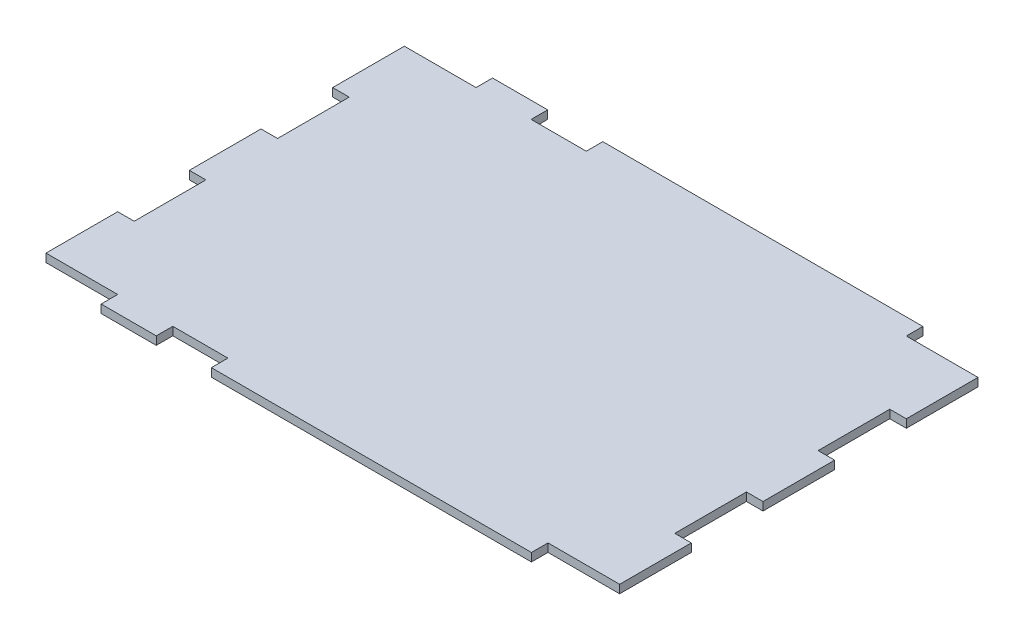
ISO-10303-21;
HEADER;
FILE_DESCRIPTION(('STEP AP214'),'2;1');
FILE_NAME('part.step','',(''),(''),'','','');
FILE_SCHEMA(('AUTOMOTIVE_DESIGN { 1 0 10303 214 1 1 1 1 }'));
ENDSEC;
DATA;
#1=APPLICATION_CONTEXT('core data for automotive mechanical design processes');
#2=APPLICATION_PROTOCOL_DEFINITION('international standard','automotive_design',2000,#1);
#3=PRODUCT_CONTEXT('',#1,'mechanical');
#4=PRODUCT('Part','Part','',(#3));
#5=PRODUCT_RELATED_PRODUCT_CATEGORY('part','',(#4));
#6=PRODUCT_DEFINITION_FORMATION('','',#4);
#7=PRODUCT_DEFINITION_CONTEXT('part definition',#1,'design');
#8=PRODUCT_DEFINITION('design','',#6,#7);
#9=PRODUCT_DEFINITION_SHAPE('','',#8);
#10=(LENGTH_UNIT() NAMED_UNIT(*) SI_UNIT(.MILLI.,.METRE.));
#11=(NAMED_UNIT(*) PLANE_ANGLE_UNIT() SI_UNIT($,.RADIAN.));
#12=(NAMED_UNIT(*) SI_UNIT($,.STERADIAN.) SOLID_ANGLE_UNIT());
#13=UNCERTAINTY_MEASURE_WITH_UNIT(LENGTH_MEASURE(1.E-05),#10,'distance_accuracy_value','');
#14=(GEOMETRIC_REPRESENTATION_CONTEXT(3) GLOBAL_UNCERTAINTY_ASSIGNED_CONTEXT((#13)) GLOBAL_UNIT_ASSIGNED_CONTEXT((#10,
#11,#12)) REPRESENTATION_CONTEXT('',''));
#15=CARTESIAN_POINT('',(0.,0.,0.));
#16=DIRECTION('',(0.,0.,1.));
#17=DIRECTION('',(1.,0.,0.));
#18=AXIS2_PLACEMENT_3D('',#15,#16,#17);
#19=CARTESIAN_POINT('',(-128.911356388129,3.,-52.));
#20=DIRECTION('',(1.,0.,0.));
#21=DIRECTION('',(0.,0.,-1.));
#22=AXIS2_PLACEMENT_3D('',#19,#20,#21);
#23=PLANE('',#22);
#24=DIRECTION('',(0.,0.,1.));
#25=VECTOR('',#24,1.);
#26=CARTESIAN_POINT('',(-128.911356388129,0.,-52.));
#27=LINE('',#26,#25);
#28=CARTESIAN_POINT('',(-128.911356388129,0.,-78.));
#29=VERTEX_POINT('',#28);
#30=CARTESIAN_POINT('',(-128.911356388129,0.,-52.));
#31=VERTEX_POINT('',#30);
#32=EDGE_CURVE('E312',#29,#31,#27,.T.);
#33=ORIENTED_EDGE('',*,*,#32,.T.);
#34=DIRECTION('',(0.,-1.,0.));
#35=VECTOR('',#34,1.);
#36=CARTESIAN_POINT('',(-128.911356388129,3.,-52.));
#37=LINE('',#36,#35);
#38=CARTESIAN_POINT('',(-128.911356388129,3.,-52.));
#39=VERTEX_POINT('',#38);
#40=EDGE_CURVE('E48',#39,#31,#37,.T.);
#41=ORIENTED_EDGE('',*,*,#40,.F.);
#42=DIRECTION('',(0.,0.,1.));
#43=VECTOR('',#42,1.);
#44=CARTESIAN_POINT('',(-128.911356388129,3.,-52.));
#45=LINE('',#44,#43);
#46=CARTESIAN_POINT('',(-128.911356388129,3.,-78.));
#47=VERTEX_POINT('',#46);
#48=EDGE_CURVE('E184',#47,#39,#45,.T.);
#49=ORIENTED_EDGE('',*,*,#48,.F.);
#50=DIRECTION('',(0.,-1.,0.));
#51=VECTOR('',#50,1.);
#52=CARTESIAN_POINT('',(-128.911356388129,3.,-78.));
#53=LINE('',#52,#51);
#54=EDGE_CURVE('E11',#47,#29,#53,.T.);
#55=ORIENTED_EDGE('',*,*,#54,.T.);
#56=EDGE_LOOP('',(#33,#41,#49,#55));
#57=FACE_BOUND('',#56,.T.);
#58=ADVANCED_FACE('F39',(#57),#23,.F.);
#59=CARTESIAN_POINT('',(-122.911356388129,3.,-52.));
#60=DIRECTION('',(0.,0.,-1.));
#61=DIRECTION('',(-1.,0.,0.));
#62=AXIS2_PLACEMENT_3D('',#59,#60,#61);
#63=PLANE('',#62);
#64=DIRECTION('',(1.,0.,0.));
#65=VECTOR('',#64,1.);
#66=CARTESIAN_POINT('',(-122.911356388129,0.,-52.));
#67=LINE('',#66,#65);
#68=CARTESIAN_POINT('',(-122.911356388129,0.,-52.));
#69=VERTEX_POINT('',#68);
#70=EDGE_CURVE('E315',#31,#69,#67,.T.);
#71=ORIENTED_EDGE('',*,*,#70,.T.);
#72=DIRECTION('',(0.,-1.,0.));
#73=VECTOR('',#72,1.);
#74=CARTESIAN_POINT('',(-122.911356388129,3.,-52.));
#75=LINE('',#74,#73);
#76=CARTESIAN_POINT('',(-122.911356388129,3.,-52.));
#77=VERTEX_POINT('',#76);
#78=EDGE_CURVE('E541',#77,#69,#75,.T.);
#79=ORIENTED_EDGE('',*,*,#78,.F.);
#80=DIRECTION('',(1.,0.,0.));
#81=VECTOR('',#80,1.);
#82=CARTESIAN_POINT('',(-122.911356388129,3.,-52.));
#83=LINE('',#82,#81);
#84=EDGE_CURVE('E551',#39,#77,#83,.T.);
#85=ORIENTED_EDGE('',*,*,#84,.F.);
#86=ORIENTED_EDGE('',*,*,#40,.T.);
#87=EDGE_LOOP('',(#71,#79,#85,#86));
#88=FACE_BOUND('',#87,.T.);
#89=ADVANCED_FACE('F549',(#88),#63,.F.);
#90=CARTESIAN_POINT('',(-122.911356388129,3.,-52.));
#91=DIRECTION('',(1.,0.,0.));
#92=DIRECTION('',(0.,0.,-1.));
#93=AXIS2_PLACEMENT_3D('',#90,#91,#92);
#94=PLANE('',#93);
#95=DIRECTION('',(0.,0.,1.));
#96=VECTOR('',#95,1.);
#97=CARTESIAN_POINT('',(-122.911356388129,0.,-52.));
#98=LINE('',#97,#96);
#99=CARTESIAN_POINT('',(-122.911356388129,0.,-26.));
#100=VERTEX_POINT('',#99);
#101=EDGE_CURVE('E318',#69,#100,#98,.T.);
#102=ORIENTED_EDGE('',*,*,#101,.T.);
#103=DIRECTION('',(0.,-1.,0.));
#104=VECTOR('',#103,1.);
#105=CARTESIAN_POINT('',(-122.911356388129,3.,-26.));
#106=LINE('',#105,#104);
#107=CARTESIAN_POINT('',(-122.911356388129,3.,-26.));
#108=VERTEX_POINT('',#107);
#109=EDGE_CURVE('E537',#108,#100,#106,.T.);
#110=ORIENTED_EDGE('',*,*,#109,.F.);
#111=DIRECTION('',(0.,0.,1.));
#112=VECTOR('',#111,1.);
#113=CARTESIAN_POINT('',(-122.911356388129,3.,-52.));
#114=LINE('',#113,#112);
#115=EDGE_CURVE('E571',#77,#108,#114,.T.);
#116=ORIENTED_EDGE('',*,*,#115,.F.);
#117=ORIENTED_EDGE('',*,*,#78,.T.);
#118=EDGE_LOOP('',(#102,#110,#116,#117));
#119=FACE_BOUND('',#118,.T.);
#120=ADVANCED_FACE('F561',(#119),#94,.F.);
#121=CARTESIAN_POINT('',(-128.911356388129,3.,-26.));
#122=DIRECTION('',(0.,0.,1.));
#123=DIRECTION('',(1.,0.,0.));
#124=AXIS2_PLACEMENT_3D('',#121,#122,#123);
#125=PLANE('',#124);
#126=DIRECTION('',(-1.,0.,0.));
#127=VECTOR('',#126,1.);
#128=CARTESIAN_POINT('',(-128.911356388129,0.,-26.));
#129=LINE('',#128,#127);
#130=CARTESIAN_POINT('',(-128.911356388129,0.,-26.));
#131=VERTEX_POINT('',#130);
#132=EDGE_CURVE('E321',#100,#131,#129,.T.);
#133=ORIENTED_EDGE('',*,*,#132,.T.);
#134=DIRECTION('',(0.,-1.,0.));
#135=VECTOR('',#134,1.);
#136=CARTESIAN_POINT('',(-128.911356388129,3.,-26.));
#137=LINE('',#136,#135);
#138=CARTESIAN_POINT('',(-128.911356388129,3.,-26.));
#139=VERTEX_POINT('',#138);
#140=EDGE_CURVE('E533',#139,#131,#137,.T.);
#141=ORIENTED_EDGE('',*,*,#140,.F.);
#142=DIRECTION('',(-1.,0.,0.));
#143=VECTOR('',#142,1.);
#144=CARTESIAN_POINT('',(-128.911356388129,3.,-26.));
#145=LINE('',#144,#143);
#146=EDGE_CURVE('E567',#108,#139,#145,.T.);
#147=ORIENTED_EDGE('',*,*,#146,.F.);
#148=ORIENTED_EDGE('',*,*,#109,.T.);
#149=EDGE_LOOP('',(#133,#141,#147,#148));
#150=FACE_BOUND('',#149,.T.);
#151=ADVANCED_FACE('F565',(#150),#125,.F.);
#152=CARTESIAN_POINT('',(-128.911356388129,3.,0.));
#153=DIRECTION('',(1.,0.,0.));
#154=DIRECTION('',(0.,0.,-1.));
#155=AXIS2_PLACEMENT_3D('',#152,#153,#154);
#156=PLANE('',#155);
#157=DIRECTION('',(0.,0.,1.));
#158=VECTOR('',#157,1.);
#159=CARTESIAN_POINT('',(-128.911356388129,0.,0.));
#160=LINE('',#159,#158);
#161=CARTESIAN_POINT('',(-128.911356388129,0.,0.));
#162=VERTEX_POINT('',#161);
#163=EDGE_CURVE('E324',#131,#162,#160,.T.);
#164=ORIENTED_EDGE('',*,*,#163,.T.);
#165=DIRECTION('',(0.,-1.,0.));
#166=VECTOR('',#165,1.);
#167=CARTESIAN_POINT('',(-128.911356388129,3.,0.));
#168=LINE('',#167,#166);
#169=CARTESIAN_POINT('',(-128.911356388129,3.,0.));
#170=VERTEX_POINT('',#169);
#171=EDGE_CURVE('E529',#170,#162,#168,.T.);
#172=ORIENTED_EDGE('',*,*,#171,.F.);
#173=DIRECTION('',(0.,0.,1.));
#174=VECTOR('',#173,1.);
#175=CARTESIAN_POINT('',(-128.911356388129,3.,0.));
#176=LINE('',#175,#174);
#177=EDGE_CURVE('E570',#139,#170,#176,.T.);
#178=ORIENTED_EDGE('',*,*,#177,.F.);
#179=ORIENTED_EDGE('',*,*,#140,.T.);
#180=EDGE_LOOP('',(#164,#172,#178,#179));
#181=FACE_BOUND('',#180,.T.);
#182=ADVANCED_FACE('F693',(#181),#156,.F.);
#183=CARTESIAN_POINT('',(-122.911356388129,3.,0.));
#184=DIRECTION('',(0.,0.,-1.));
#185=DIRECTION('',(-1.,0.,0.));
#186=AXIS2_PLACEMENT_3D('',#183,#184,#185);
#187=PLANE('',#186);
#188=DIRECTION('',(1.,0.,0.));
#189=VECTOR('',#188,1.);
#190=CARTESIAN_POINT('',(-122.911356388129,0.,0.));
#191=LINE('',#190,#189);
#192=CARTESIAN_POINT('',(-122.911356388129,0.,0.));
#193=VERTEX_POINT('',#192);
#194=EDGE_CURVE('E327',#162,#193,#191,.T.);
#195=ORIENTED_EDGE('',*,*,#194,.T.);
#196=DIRECTION('',(0.,-1.,0.));
#197=VECTOR('',#196,1.);
#198=CARTESIAN_POINT('',(-122.911356388129,3.,0.));
#199=LINE('',#198,#197);
#200=CARTESIAN_POINT('',(-122.911356388129,3.,0.));
#201=VERTEX_POINT('',#200);
#202=EDGE_CURVE('E525',#201,#193,#199,.T.);
#203=ORIENTED_EDGE('',*,*,#202,.F.);
#204=DIRECTION('',(1.,0.,0.));
#205=VECTOR('',#204,1.);
#206=CARTESIAN_POINT('',(-122.911356388129,3.,0.));
#207=LINE('',#206,#205);
#208=EDGE_CURVE('E575',#170,#201,#207,.T.);
#209=ORIENTED_EDGE('',*,*,#208,.F.);
#210=ORIENTED_EDGE('',*,*,#171,.T.);
#211=EDGE_LOOP('',(#195,#203,#209,#210));
#212=FACE_BOUND('',#211,.T.);
#213=ADVANCED_FACE('F696',(#212),#187,.F.);
#214=CARTESIAN_POINT('',(-122.911356388129,3.,0.));
#215=DIRECTION('',(1.,0.,0.));
#216=DIRECTION('',(0.,0.,-1.));
#217=AXIS2_PLACEMENT_3D('',#214,#215,#216);
#218=PLANE('',#217);
#219=DIRECTION('',(0.,0.,1.));
#220=VECTOR('',#219,1.);
#221=CARTESIAN_POINT('',(-122.911356388129,0.,0.));
#222=LINE('',#221,#220);
#223=CARTESIAN_POINT('',(-122.911356388129,0.,26.));
#224=VERTEX_POINT('',#223);
#225=EDGE_CURVE('E330',#193,#224,#222,.T.);
#226=ORIENTED_EDGE('',*,*,#225,.T.);
#227=DIRECTION('',(0.,-1.,0.));
#228=VECTOR('',#227,1.);
#229=CARTESIAN_POINT('',(-122.911356388129,3.,26.));
#230=LINE('',#229,#228);
#231=CARTESIAN_POINT('',(-122.911356388129,3.,26.));
#232=VERTEX_POINT('',#231);
#233=EDGE_CURVE('E521',#232,#224,#230,.T.);
#234=ORIENTED_EDGE('',*,*,#233,.F.);
#235=DIRECTION('',(0.,0.,1.));
#236=VECTOR('',#235,1.);
#237=CARTESIAN_POINT('',(-122.911356388129,3.,0.));
#238=LINE('',#237,#236);
#239=EDGE_CURVE('E582',#201,#232,#238,.T.);
#240=ORIENTED_EDGE('',*,*,#239,.F.);
#241=ORIENTED_EDGE('',*,*,#202,.T.);
#242=EDGE_LOOP('',(#226,#234,#240,#241));
#243=FACE_BOUND('',#242,.T.);
#244=ADVANCED_FACE('F700',(#243),#218,.F.);
#245=CARTESIAN_POINT('',(-128.911356388129,3.,26.));
#246=DIRECTION('',(0.,0.,1.));
#247=DIRECTION('',(1.,0.,0.));
#248=AXIS2_PLACEMENT_3D('',#245,#246,#247);
#249=PLANE('',#248);
#250=DIRECTION('',(-1.,0.,0.));
#251=VECTOR('',#250,1.);
#252=CARTESIAN_POINT('',(-128.911356388129,0.,26.));
#253=LINE('',#252,#251);
#254=CARTESIAN_POINT('',(-128.911356388129,0.,26.));
#255=VERTEX_POINT('',#254);
#256=EDGE_CURVE('E333',#224,#255,#253,.T.);
#257=ORIENTED_EDGE('',*,*,#256,.T.);
#258=DIRECTION('',(0.,-1.,0.));
#259=VECTOR('',#258,1.);
#260=CARTESIAN_POINT('',(-128.911356388129,3.,26.));
#261=LINE('',#260,#259);
#262=CARTESIAN_POINT('',(-128.911356388129,3.,26.));
#263=VERTEX_POINT('',#262);
#264=EDGE_CURVE('E517',#263,#255,#261,.T.);
#265=ORIENTED_EDGE('',*,*,#264,.F.);
#266=DIRECTION('',(-1.,0.,0.));
#267=VECTOR('',#266,1.);
#268=CARTESIAN_POINT('',(-128.911356388129,3.,26.));
#269=LINE('',#268,#267);
#270=EDGE_CURVE('E585',#232,#263,#269,.T.);
#271=ORIENTED_EDGE('',*,*,#270,.F.);
#272=ORIENTED_EDGE('',*,*,#233,.T.);
#273=EDGE_LOOP('',(#257,#265,#271,#272));
#274=FACE_BOUND('',#273,.T.);
#275=ADVANCED_FACE('F704',(#274),#249,.F.);
#276=CARTESIAN_POINT('',(-128.911356388129,3.,52.));
#277=DIRECTION('',(1.,0.,0.));
#278=DIRECTION('',(0.,0.,-1.));
#279=AXIS2_PLACEMENT_3D('',#276,#277,#278);
#280=PLANE('',#279);
#281=DIRECTION('',(0.,0.,1.));
#282=VECTOR('',#281,1.);
#283=CARTESIAN_POINT('',(-128.911356388129,0.,52.));
#284=LINE('',#283,#282);
#285=CARTESIAN_POINT('',(-128.911356388129,0.,52.));
#286=VERTEX_POINT('',#285);
#287=EDGE_CURVE('E336',#255,#286,#284,.T.);
#288=ORIENTED_EDGE('',*,*,#287,.T.);
#289=DIRECTION('',(0.,-1.,0.));
#290=VECTOR('',#289,1.);
#291=CARTESIAN_POINT('',(-128.911356388129,3.,52.));
#292=LINE('',#291,#290);
#293=CARTESIAN_POINT('',(-128.911356388129,3.,52.));
#294=VERTEX_POINT('',#293);
#295=EDGE_CURVE('E513',#294,#286,#292,.T.);
#296=ORIENTED_EDGE('',*,*,#295,.F.);
#297=DIRECTION('',(0.,0.,1.));
#298=VECTOR('',#297,1.);
#299=CARTESIAN_POINT('',(-128.911356388129,3.,52.));
#300=LINE('',#299,#298);
#301=EDGE_CURVE('E588',#263,#294,#300,.T.);
#302=ORIENTED_EDGE('',*,*,#301,.F.);
#303=ORIENTED_EDGE('',*,*,#264,.T.);
#304=EDGE_LOOP('',(#288,#296,#302,#303));
#305=FACE_BOUND('',#304,.T.);
#306=ADVANCED_FACE('F708',(#305),#280,.F.);
#307=CARTESIAN_POINT('',(-122.911356388129,3.,52.));
#308=DIRECTION('',(0.,0.,-1.));
#309=DIRECTION('',(-1.,0.,0.));
#310=AXIS2_PLACEMENT_3D('',#307,#308,#309);
#311=PLANE('',#310);
#312=DIRECTION('',(1.,0.,0.));
#313=VECTOR('',#312,1.);
#314=CARTESIAN_POINT('',(-122.911356388129,0.,52.));
#315=LINE('',#314,#313);
#316=CARTESIAN_POINT('',(-102.911356388129,0.,52.));
#317=VERTEX_POINT('',#316);
#318=EDGE_CURVE('E340',#286,#317,#315,.T.);
#319=ORIENTED_EDGE('',*,*,#318,.T.);
#320=DIRECTION('',(0.,-1.,0.));
#321=VECTOR('',#320,1.);
#322=CARTESIAN_POINT('',(-102.911356388129,3.,52.));
#323=LINE('',#322,#321);
#324=CARTESIAN_POINT('',(-102.911356388129,3.,52.));
#325=VERTEX_POINT('',#324);
#326=EDGE_CURVE('E509',#325,#317,#323,.T.);
#327=ORIENTED_EDGE('',*,*,#326,.F.);
#328=DIRECTION('',(1.,0.,0.));
#329=VECTOR('',#328,1.);
#330=CARTESIAN_POINT('',(-122.911356388129,3.,52.));
#331=LINE('',#330,#329);
#332=EDGE_CURVE('E591',#294,#325,#331,.T.);
#333=ORIENTED_EDGE('',*,*,#332,.F.);
#334=ORIENTED_EDGE('',*,*,#295,.T.);
#335=EDGE_LOOP('',(#319,#327,#333,#334));
#336=FACE_BOUND('',#335,.T.);
#337=ADVANCED_FACE('F712',(#336),#311,.F.);
#338=CARTESIAN_POINT('',(-102.911356388129,3.,52.));
#339=DIRECTION('',(1.,0.,0.));
#340=DIRECTION('',(0.,0.,-1.));
#341=AXIS2_PLACEMENT_3D('',#338,#339,#340);
#342=PLANE('',#341);
#343=DIRECTION('',(0.,0.,1.));
#344=VECTOR('',#343,1.);
#345=CARTESIAN_POINT('',(-102.911356388129,0.,52.));
#346=LINE('',#345,#344);
#347=CARTESIAN_POINT('',(-102.911356388129,0.,58.));
#348=VERTEX_POINT('',#347);
#349=EDGE_CURVE('E343',#317,#348,#346,.T.);
#350=ORIENTED_EDGE('',*,*,#349,.T.);
#351=DIRECTION('',(0.,-1.,0.));
#352=VECTOR('',#351,1.);
#353=CARTESIAN_POINT('',(-102.911356388129,3.,58.));
#354=LINE('',#353,#352);
#355=CARTESIAN_POINT('',(-102.911356388129,3.,58.));
#356=VERTEX_POINT('',#355);
#357=EDGE_CURVE('E505',#356,#348,#354,.T.);
#358=ORIENTED_EDGE('',*,*,#357,.F.);
#359=DIRECTION('',(0.,0.,1.));
#360=VECTOR('',#359,1.);
#361=CARTESIAN_POINT('',(-102.911356388129,3.,52.));
#362=LINE('',#361,#360);
#363=EDGE_CURVE('E594',#325,#356,#362,.T.);
#364=ORIENTED_EDGE('',*,*,#363,.F.);
#365=ORIENTED_EDGE('',*,*,#326,.T.);
#366=EDGE_LOOP('',(#350,#358,#364,#365));
#367=FACE_BOUND('',#366,.T.);
#368=ADVANCED_FACE('F716',(#367),#342,.F.);
#369=CARTESIAN_POINT('',(-102.911356388129,3.,58.));
#370=DIRECTION('',(0.,0.,-1.));
#371=DIRECTION('',(-1.,0.,0.));
#372=AXIS2_PLACEMENT_3D('',#369,#370,#371);
#373=PLANE('',#372);
#374=DIRECTION('',(1.,0.,0.));
#375=VECTOR('',#374,1.);
#376=CARTESIAN_POINT('',(-102.911356388129,0.,58.));
#377=LINE('',#376,#375);
#378=CARTESIAN_POINT('',(-82.9113563881286,0.,58.));
#379=VERTEX_POINT('',#378);
#380=EDGE_CURVE('E346',#348,#379,#377,.T.);
#381=ORIENTED_EDGE('',*,*,#380,.T.);
#382=DIRECTION('',(0.,-1.,0.));
#383=VECTOR('',#382,1.);
#384=CARTESIAN_POINT('',(-82.9113563881286,3.,58.));
#385=LINE('',#384,#383);
#386=CARTESIAN_POINT('',(-82.9113563881286,3.,58.));
#387=VERTEX_POINT('',#386);
#388=EDGE_CURVE('E501',#387,#379,#385,.T.);
#389=ORIENTED_EDGE('',*,*,#388,.F.);
#390=DIRECTION('',(1.,0.,0.));
#391=VECTOR('',#390,1.);
#392=CARTESIAN_POINT('',(-102.911356388129,3.,58.));
#393=LINE('',#392,#391);
#394=EDGE_CURVE('E597',#356,#387,#393,.T.);
#395=ORIENTED_EDGE('',*,*,#394,.F.);
#396=ORIENTED_EDGE('',*,*,#357,.T.);
#397=EDGE_LOOP('',(#381,#389,#395,#396));
#398=FACE_BOUND('',#397,.T.);
#399=ADVANCED_FACE('F720',(#398),#373,.F.);
#400=CARTESIAN_POINT('',(-82.9113563881286,3.,58.));
#401=DIRECTION('',(-1.,0.,0.));
#402=DIRECTION('',(0.,0.,1.));
#403=AXIS2_PLACEMENT_3D('',#400,#401,#402);
#404=PLANE('',#403);
#405=DIRECTION('',(0.,0.,-1.));
#406=VECTOR('',#405,1.);
#407=CARTESIAN_POINT('',(-82.9113563881286,0.,58.));
#408=LINE('',#407,#406);
#409=CARTESIAN_POINT('',(-82.9113563881286,0.,52.));
#410=VERTEX_POINT('',#409);
#411=EDGE_CURVE('E349',#379,#410,#408,.T.);
#412=ORIENTED_EDGE('',*,*,#411,.T.);
#413=DIRECTION('',(0.,-1.,0.));
#414=VECTOR('',#413,1.);
#415=CARTESIAN_POINT('',(-82.9113563881286,3.,52.));
#416=LINE('',#415,#414);
#417=CARTESIAN_POINT('',(-82.9113563881286,3.,52.));
#418=VERTEX_POINT('',#417);
#419=EDGE_CURVE('E497',#418,#410,#416,.T.);
#420=ORIENTED_EDGE('',*,*,#419,.F.);
#421=DIRECTION('',(0.,0.,-1.));
#422=VECTOR('',#421,1.);
#423=CARTESIAN_POINT('',(-82.9113563881286,3.,58.));
#424=LINE('',#423,#422);
#425=EDGE_CURVE('E600',#387,#418,#424,.T.);
#426=ORIENTED_EDGE('',*,*,#425,.F.);
#427=ORIENTED_EDGE('',*,*,#388,.T.);
#428=EDGE_LOOP('',(#412,#420,#426,#427));
#429=FACE_BOUND('',#428,.T.);
#430=ADVANCED_FACE('F724',(#429),#404,.F.);
#431=CARTESIAN_POINT('',(-82.9113563881286,3.,52.));
#432=DIRECTION('',(0.,0.,-1.));
#433=DIRECTION('',(-1.,0.,0.));
#434=AXIS2_PLACEMENT_3D('',#431,#432,#433);
#435=PLANE('',#434);
#436=DIRECTION('',(1.,0.,0.));
#437=VECTOR('',#436,1.);
#438=CARTESIAN_POINT('',(-82.9113563881286,0.,52.));
#439=LINE('',#438,#437);
#440=CARTESIAN_POINT('',(-62.9113563881286,0.,52.));
#441=VERTEX_POINT('',#440);
#442=EDGE_CURVE('E352',#410,#441,#439,.T.);
#443=ORIENTED_EDGE('',*,*,#442,.T.);
#444=DIRECTION('',(0.,-1.,0.));
#445=VECTOR('',#444,1.);
#446=CARTESIAN_POINT('',(-62.9113563881286,3.,52.));
#447=LINE('',#446,#445);
#448=CARTESIAN_POINT('',(-62.9113563881286,3.,52.));
#449=VERTEX_POINT('',#448);
#450=EDGE_CURVE('E493',#449,#441,#447,.T.);
#451=ORIENTED_EDGE('',*,*,#450,.F.);
#452=DIRECTION('',(1.,0.,0.));
#453=VECTOR('',#452,1.);
#454=CARTESIAN_POINT('',(-82.9113563881286,3.,52.));
#455=LINE('',#454,#453);
#456=EDGE_CURVE('E603',#418,#449,#455,.T.);
#457=ORIENTED_EDGE('',*,*,#456,.F.);
#458=ORIENTED_EDGE('',*,*,#419,.T.);
#459=EDGE_LOOP('',(#443,#451,#457,#458));
#460=FACE_BOUND('',#459,.T.);
#461=ADVANCED_FACE('F728',(#460),#435,.F.);
#462=CARTESIAN_POINT('',(-62.9113563881286,3.,52.));
#463=DIRECTION('',(1.,0.,0.));
#464=DIRECTION('',(0.,0.,-1.));
#465=AXIS2_PLACEMENT_3D('',#462,#463,#464);
#466=PLANE('',#465);
#467=DIRECTION('',(0.,0.,1.));
#468=VECTOR('',#467,1.);
#469=CARTESIAN_POINT('',(-62.9113563881286,0.,52.));
#470=LINE('',#469,#468);
#471=CARTESIAN_POINT('',(-62.9113563881286,0.,58.));
#472=VERTEX_POINT('',#471);
#473=EDGE_CURVE('E355',#441,#472,#470,.T.);
#474=ORIENTED_EDGE('',*,*,#473,.T.);
#475=DIRECTION('',(0.,-1.,0.));
#476=VECTOR('',#475,1.);
#477=CARTESIAN_POINT('',(-62.9113563881286,3.,58.));
#478=LINE('',#477,#476);
#479=CARTESIAN_POINT('',(-62.9113563881286,3.,58.));
#480=VERTEX_POINT('',#479);
#481=EDGE_CURVE('E489',#480,#472,#478,.T.);
#482=ORIENTED_EDGE('',*,*,#481,.F.);
#483=DIRECTION('',(0.,0.,1.));
#484=VECTOR('',#483,1.);
#485=CARTESIAN_POINT('',(-62.9113563881286,3.,52.));
#486=LINE('',#485,#484);
#487=EDGE_CURVE('E606',#449,#480,#486,.T.);
#488=ORIENTED_EDGE('',*,*,#487,.F.);
#489=ORIENTED_EDGE('',*,*,#450,.T.);
#490=EDGE_LOOP('',(#474,#482,#488,#489));
#491=FACE_BOUND('',#490,.T.);
#492=ADVANCED_FACE('F732',(#491),#466,.F.);
#493=CARTESIAN_POINT('',(-62.9113563881286,3.,58.));
#494=DIRECTION('',(0.,0.,-1.));
#495=DIRECTION('',(-1.,0.,0.));
#496=AXIS2_PLACEMENT_3D('',#493,#494,#495);
#497=PLANE('',#496);
#498=DIRECTION('',(1.,0.,0.));
#499=VECTOR('',#498,1.);
#500=CARTESIAN_POINT('',(-62.9113563881286,0.,58.));
#501=LINE('',#500,#499);
#502=CARTESIAN_POINT('',(53.1886436118714,0.,57.9999999999999));
#503=VERTEX_POINT('',#502);
#504=EDGE_CURVE('E358',#472,#503,#501,.T.);
#505=ORIENTED_EDGE('',*,*,#504,.T.);
#506=DIRECTION('',(0.,-1.,0.));
#507=VECTOR('',#506,1.);
#508=CARTESIAN_POINT('',(53.1886436118714,3.,57.9999999999999));
#509=LINE('',#508,#507);
#510=CARTESIAN_POINT('',(53.1886436118714,3.,57.9999999999999));
#511=VERTEX_POINT('',#510);
#512=EDGE_CURVE('E485',#511,#503,#509,.T.);
#513=ORIENTED_EDGE('',*,*,#512,.F.);
#514=DIRECTION('',(1.,0.,0.));
#515=VECTOR('',#514,1.);
#516=CARTESIAN_POINT('',(-62.9113563881286,3.,58.));
#517=LINE('',#516,#515);
#518=EDGE_CURVE('E609',#480,#511,#517,.T.);
#519=ORIENTED_EDGE('',*,*,#518,.F.);
#520=ORIENTED_EDGE('',*,*,#481,.T.);
#521=EDGE_LOOP('',(#505,#513,#519,#520));
#522=FACE_BOUND('',#521,.T.);
#523=ADVANCED_FACE('F736',(#522),#497,.F.);
#524=CARTESIAN_POINT('',(53.1886436118714,3.,57.9999999999999));
#525=DIRECTION('',(-1.,0.,0.));
#526=DIRECTION('',(0.,0.,1.));
#527=AXIS2_PLACEMENT_3D('',#524,#525,#526);
#528=PLANE('',#527);
#529=DIRECTION('',(0.,0.,-1.));
#530=VECTOR('',#529,1.);
#531=CARTESIAN_POINT('',(53.1886436118714,0.,57.9999999999999));
#532=LINE('',#531,#530);
#533=CARTESIAN_POINT('',(53.1886436118714,0.,52.));
#534=VERTEX_POINT('',#533);
#535=EDGE_CURVE('E361',#503,#534,#532,.T.);
#536=ORIENTED_EDGE('',*,*,#535,.T.);
#537=DIRECTION('',(0.,-1.,0.));
#538=VECTOR('',#537,1.);
#539=CARTESIAN_POINT('',(53.1886436118714,3.,52.));
#540=LINE('',#539,#538);
#541=CARTESIAN_POINT('',(53.1886436118714,3.,52.));
#542=VERTEX_POINT('',#541);
#543=EDGE_CURVE('E481',#542,#534,#540,.T.);
#544=ORIENTED_EDGE('',*,*,#543,.F.);
#545=DIRECTION('',(0.,0.,-1.));
#546=VECTOR('',#545,1.);
#547=CARTESIAN_POINT('',(53.1886436118714,3.,57.9999999999999));
#548=LINE('',#547,#546);
#549=EDGE_CURVE('E612',#511,#542,#548,.T.);
#550=ORIENTED_EDGE('',*,*,#549,.F.);
#551=ORIENTED_EDGE('',*,*,#512,.T.);
#552=EDGE_LOOP('',(#536,#544,#550,#551));
#553=FACE_BOUND('',#552,.T.);
#554=ADVANCED_FACE('F740',(#553),#528,.F.);
#555=CARTESIAN_POINT('',(73.1886436118714,3.,52.));
#556=DIRECTION('',(0.,0.,-1.));
#557=DIRECTION('',(-1.,0.,0.));
#558=AXIS2_PLACEMENT_3D('',#555,#556,#557);
#559=PLANE('',#558);
#560=DIRECTION('',(1.,0.,0.));
#561=VECTOR('',#560,1.);
#562=CARTESIAN_POINT('',(73.1886436118714,0.,52.));
#563=LINE('',#562,#561);
#564=CARTESIAN_POINT('',(79.1886436118714,0.,52.));
#565=VERTEX_POINT('',#564);
#566=EDGE_CURVE('E365',#534,#565,#563,.T.);
#567=ORIENTED_EDGE('',*,*,#566,.T.);
#568=DIRECTION('',(0.,-1.,0.));
#569=VECTOR('',#568,1.);
#570=CARTESIAN_POINT('',(79.1886436118714,3.,52.));
#571=LINE('',#570,#569);
#572=CARTESIAN_POINT('',(79.1886436118714,3.,52.));
#573=VERTEX_POINT('',#572);
#574=EDGE_CURVE('E477',#573,#565,#571,.T.);
#575=ORIENTED_EDGE('',*,*,#574,.F.);
#576=DIRECTION('',(1.,0.,0.));
#577=VECTOR('',#576,1.);
#578=CARTESIAN_POINT('',(53.1886436118714,3.,52.));
#579=LINE('',#578,#577);
#580=EDGE_CURVE('E615',#542,#573,#579,.T.);
#581=ORIENTED_EDGE('',*,*,#580,.F.);
#582=ORIENTED_EDGE('',*,*,#543,.T.);
#583=EDGE_LOOP('',(#567,#575,#581,#582));
#584=FACE_BOUND('',#583,.T.);
#585=ADVANCED_FACE('F744',(#584),#559,.F.);
#586=CARTESIAN_POINT('',(79.1886436118714,3.,52.));
#587=DIRECTION('',(-1.,0.,0.));
#588=DIRECTION('',(0.,0.,1.));
#589=AXIS2_PLACEMENT_3D('',#586,#587,#588);
#590=PLANE('',#589);
#591=DIRECTION('',(0.,0.,-1.));
#592=VECTOR('',#591,1.);
#593=CARTESIAN_POINT('',(79.1886436118714,0.,52.));
#594=LINE('',#593,#592);
#595=CARTESIAN_POINT('',(79.1886436118714,0.,26.));
#596=VERTEX_POINT('',#595);
#597=EDGE_CURVE('E368',#565,#596,#594,.T.);
#598=ORIENTED_EDGE('',*,*,#597,.T.);
#599=DIRECTION('',(0.,-1.,0.));
#600=VECTOR('',#599,1.);
#601=CARTESIAN_POINT('',(79.1886436118714,3.,26.));
#602=LINE('',#601,#600);
#603=CARTESIAN_POINT('',(79.1886436118714,3.,26.));
#604=VERTEX_POINT('',#603);
#605=EDGE_CURVE('E473',#604,#596,#602,.T.);
#606=ORIENTED_EDGE('',*,*,#605,.F.);
#607=DIRECTION('',(0.,0.,-1.));
#608=VECTOR('',#607,1.);
#609=CARTESIAN_POINT('',(79.1886436118714,3.,52.));
#610=LINE('',#609,#608);
#611=EDGE_CURVE('E618',#573,#604,#610,.T.);
#612=ORIENTED_EDGE('',*,*,#611,.F.);
#613=ORIENTED_EDGE('',*,*,#574,.T.);
#614=EDGE_LOOP('',(#598,#606,#612,#613));
#615=FACE_BOUND('',#614,.T.);
#616=ADVANCED_FACE('F748',(#615),#590,.F.);
#617=CARTESIAN_POINT('',(79.1886436118714,3.,26.));
#618=DIRECTION('',(0.,0.,1.));
#619=DIRECTION('',(1.,0.,0.));
#620=AXIS2_PLACEMENT_3D('',#617,#618,#619);
#621=PLANE('',#620);
#622=DIRECTION('',(-1.,0.,0.));
#623=VECTOR('',#622,1.);
#624=CARTESIAN_POINT('',(79.1886436118714,0.,26.));
#625=LINE('',#624,#623);
#626=CARTESIAN_POINT('',(73.1886436118714,0.,26.));
#627=VERTEX_POINT('',#626);
#628=EDGE_CURVE('E371',#596,#627,#625,.T.);
#629=ORIENTED_EDGE('',*,*,#628,.T.);
#630=DIRECTION('',(0.,-1.,0.));
#631=VECTOR('',#630,1.);
#632=CARTESIAN_POINT('',(73.1886436118714,3.,26.));
#633=LINE('',#632,#631);
#634=CARTESIAN_POINT('',(73.1886436118714,3.,26.));
#635=VERTEX_POINT('',#634);
#636=EDGE_CURVE('E469',#635,#627,#633,.T.);
#637=ORIENTED_EDGE('',*,*,#636,.F.);
#638=DIRECTION('',(-1.,0.,0.));
#639=VECTOR('',#638,1.);
#640=CARTESIAN_POINT('',(79.1886436118714,3.,26.));
#641=LINE('',#640,#639);
#642=EDGE_CURVE('E621',#604,#635,#641,.T.);
#643=ORIENTED_EDGE('',*,*,#642,.F.);
#644=ORIENTED_EDGE('',*,*,#605,.T.);
#645=EDGE_LOOP('',(#629,#637,#643,#644));
#646=FACE_BOUND('',#645,.T.);
#647=ADVANCED_FACE('F752',(#646),#621,.F.);
#648=CARTESIAN_POINT('',(73.1886436118714,3.,0.));
#649=DIRECTION('',(-1.,0.,0.));
#650=DIRECTION('',(0.,0.,1.));
#651=AXIS2_PLACEMENT_3D('',#648,#649,#650);
#652=PLANE('',#651);
#653=DIRECTION('',(0.,0.,-1.));
#654=VECTOR('',#653,1.);
#655=CARTESIAN_POINT('',(73.1886436118714,0.,0.));
#656=LINE('',#655,#654);
#657=CARTESIAN_POINT('',(73.1886436118714,0.,0.));
#658=VERTEX_POINT('',#657);
#659=EDGE_CURVE('E374',#627,#658,#656,.T.);
#660=ORIENTED_EDGE('',*,*,#659,.T.);
#661=DIRECTION('',(0.,-1.,0.));
#662=VECTOR('',#661,1.);
#663=CARTESIAN_POINT('',(73.1886436118714,3.,0.));
#664=LINE('',#663,#662);
#665=CARTESIAN_POINT('',(73.1886436118714,3.,0.));
#666=VERTEX_POINT('',#665);
#667=EDGE_CURVE('E465',#666,#658,#664,.T.);
#668=ORIENTED_EDGE('',*,*,#667,.F.);
#669=DIRECTION('',(0.,0.,-1.));
#670=VECTOR('',#669,1.);
#671=CARTESIAN_POINT('',(73.1886436118714,3.,0.));
#672=LINE('',#671,#670);
#673=EDGE_CURVE('E624',#635,#666,#672,.T.);
#674=ORIENTED_EDGE('',*,*,#673,.F.);
#675=ORIENTED_EDGE('',*,*,#636,.T.);
#676=EDGE_LOOP('',(#660,#668,#674,#675));
#677=FACE_BOUND('',#676,.T.);
#678=ADVANCED_FACE('F756',(#677),#652,.F.);
#679=CARTESIAN_POINT('',(73.1886436118714,3.,0.));
#680=DIRECTION('',(0.,0.,-1.));
#681=DIRECTION('',(-1.,0.,0.));
#682=AXIS2_PLACEMENT_3D('',#679,#680,#681);
#683=PLANE('',#682);
#684=DIRECTION('',(1.,0.,0.));
#685=VECTOR('',#684,1.);
#686=CARTESIAN_POINT('',(73.1886436118714,0.,0.));
#687=LINE('',#686,#685);
#688=CARTESIAN_POINT('',(79.1886436118714,0.,0.));
#689=VERTEX_POINT('',#688);
#690=EDGE_CURVE('E377',#658,#689,#687,.T.);
#691=ORIENTED_EDGE('',*,*,#690,.T.);
#692=DIRECTION('',(0.,-1.,0.));
#693=VECTOR('',#692,1.);
#694=CARTESIAN_POINT('',(79.1886436118714,3.,0.));
#695=LINE('',#694,#693);
#696=CARTESIAN_POINT('',(79.1886436118714,3.,0.));
#697=VERTEX_POINT('',#696);
#698=EDGE_CURVE('E461',#697,#689,#695,.T.);
#699=ORIENTED_EDGE('',*,*,#698,.F.);
#700=DIRECTION('',(1.,0.,0.));
#701=VECTOR('',#700,1.);
#702=CARTESIAN_POINT('',(73.1886436118714,3.,0.));
#703=LINE('',#702,#701);
#704=EDGE_CURVE('E627',#666,#697,#703,.T.);
#705=ORIENTED_EDGE('',*,*,#704,.F.);
#706=ORIENTED_EDGE('',*,*,#667,.T.);
#707=EDGE_LOOP('',(#691,#699,#705,#706));
#708=FACE_BOUND('',#707,.T.);
#709=ADVANCED_FACE('F760',(#708),#683,.F.);
#710=CARTESIAN_POINT('',(79.1886436118714,3.,0.));
#711=DIRECTION('',(-1.,0.,0.));
#712=DIRECTION('',(0.,0.,1.));
#713=AXIS2_PLACEMENT_3D('',#710,#711,#712);
#714=PLANE('',#713);
#715=DIRECTION('',(0.,0.,-1.));
#716=VECTOR('',#715,1.);
#717=CARTESIAN_POINT('',(79.1886436118714,0.,0.));
#718=LINE('',#717,#716);
#719=CARTESIAN_POINT('',(79.1886436118714,0.,-26.));
#720=VERTEX_POINT('',#719);
#721=EDGE_CURVE('E380',#689,#720,#718,.T.);
#722=ORIENTED_EDGE('',*,*,#721,.T.);
#723=DIRECTION('',(0.,-1.,0.));
#724=VECTOR('',#723,1.);
#725=CARTESIAN_POINT('',(79.1886436118714,3.,-26.));
#726=LINE('',#725,#724);
#727=CARTESIAN_POINT('',(79.1886436118714,3.,-26.));
#728=VERTEX_POINT('',#727);
#729=EDGE_CURVE('E457',#728,#720,#726,.T.);
#730=ORIENTED_EDGE('',*,*,#729,.F.);
#731=DIRECTION('',(0.,0.,-1.));
#732=VECTOR('',#731,1.);
#733=CARTESIAN_POINT('',(79.1886436118714,3.,0.));
#734=LINE('',#733,#732);
#735=EDGE_CURVE('E630',#697,#728,#734,.T.);
#736=ORIENTED_EDGE('',*,*,#735,.F.);
#737=ORIENTED_EDGE('',*,*,#698,.T.);
#738=EDGE_LOOP('',(#722,#730,#736,#737));
#739=FACE_BOUND('',#738,.T.);
#740=ADVANCED_FACE('F764',(#739),#714,.F.);
#741=CARTESIAN_POINT('',(79.1886436118714,3.,-26.));
#742=DIRECTION('',(0.,0.,1.));
#743=DIRECTION('',(1.,0.,0.));
#744=AXIS2_PLACEMENT_3D('',#741,#742,#743);
#745=PLANE('',#744);
#746=DIRECTION('',(-1.,0.,0.));
#747=VECTOR('',#746,1.);
#748=CARTESIAN_POINT('',(79.1886436118714,0.,-26.));
#749=LINE('',#748,#747);
#750=CARTESIAN_POINT('',(73.1886436118714,0.,-26.));
#751=VERTEX_POINT('',#750);
#752=EDGE_CURVE('E383',#720,#751,#749,.T.);
#753=ORIENTED_EDGE('',*,*,#752,.T.);
#754=DIRECTION('',(0.,-1.,0.));
#755=VECTOR('',#754,1.);
#756=CARTESIAN_POINT('',(73.1886436118714,3.,-26.));
#757=LINE('',#756,#755);
#758=CARTESIAN_POINT('',(73.1886436118714,3.,-26.));
#759=VERTEX_POINT('',#758);
#760=EDGE_CURVE('E453',#759,#751,#757,.T.);
#761=ORIENTED_EDGE('',*,*,#760,.F.);
#762=DIRECTION('',(-1.,0.,0.));
#763=VECTOR('',#762,1.);
#764=CARTESIAN_POINT('',(79.1886436118714,3.,-26.));
#765=LINE('',#764,#763);
#766=EDGE_CURVE('E633',#728,#759,#765,.T.);
#767=ORIENTED_EDGE('',*,*,#766,.F.);
#768=ORIENTED_EDGE('',*,*,#729,.T.);
#769=EDGE_LOOP('',(#753,#761,#767,#768));
#770=FACE_BOUND('',#769,.T.);
#771=ADVANCED_FACE('F768',(#770),#745,.F.);
#772=CARTESIAN_POINT('',(73.1886436118713,3.,-52.));
#773=DIRECTION('',(-1.,0.,0.));
#774=DIRECTION('',(0.,0.,1.));
#775=AXIS2_PLACEMENT_3D('',#772,#773,#774);
#776=PLANE('',#775);
#777=DIRECTION('',(0.,0.,-1.));
#778=VECTOR('',#777,1.);
#779=CARTESIAN_POINT('',(73.1886436118713,0.,-52.));
#780=LINE('',#779,#778);
#781=CARTESIAN_POINT('',(73.1886436118713,0.,-52.));
#782=VERTEX_POINT('',#781);
#783=EDGE_CURVE('E386',#751,#782,#780,.T.);
#784=ORIENTED_EDGE('',*,*,#783,.T.);
#785=DIRECTION('',(0.,-1.,0.));
#786=VECTOR('',#785,1.);
#787=CARTESIAN_POINT('',(73.1886436118713,3.,-52.));
#788=LINE('',#787,#786);
#789=CARTESIAN_POINT('',(73.1886436118713,3.,-52.));
#790=VERTEX_POINT('',#789);
#791=EDGE_CURVE('E449',#790,#782,#788,.T.);
#792=ORIENTED_EDGE('',*,*,#791,.F.);
#793=DIRECTION('',(0.,0.,-1.));
#794=VECTOR('',#793,1.);
#795=CARTESIAN_POINT('',(73.1886436118713,3.,-52.));
#796=LINE('',#795,#794);
#797=EDGE_CURVE('E636',#759,#790,#796,.T.);
#798=ORIENTED_EDGE('',*,*,#797,.F.);
#799=ORIENTED_EDGE('',*,*,#760,.T.);
#800=EDGE_LOOP('',(#784,#792,#798,#799));
#801=FACE_BOUND('',#800,.T.);
#802=ADVANCED_FACE('F772',(#801),#776,.F.);
#803=CARTESIAN_POINT('',(73.1886436118713,3.,-52.));
#804=DIRECTION('',(0.,0.,-1.));
#805=DIRECTION('',(-1.,0.,0.));
#806=AXIS2_PLACEMENT_3D('',#803,#804,#805);
#807=PLANE('',#806);
#808=DIRECTION('',(1.,0.,0.));
#809=VECTOR('',#808,1.);
#810=CARTESIAN_POINT('',(73.1886436118713,0.,-52.));
#811=LINE('',#810,#809);
#812=CARTESIAN_POINT('',(79.1886436118713,0.,-52.));
#813=VERTEX_POINT('',#812);
#814=EDGE_CURVE('E389',#782,#813,#811,.T.);
#815=ORIENTED_EDGE('',*,*,#814,.T.);
#816=DIRECTION('',(0.,-1.,0.));
#817=VECTOR('',#816,1.);
#818=CARTESIAN_POINT('',(79.1886436118713,3.,-52.));
#819=LINE('',#818,#817);
#820=CARTESIAN_POINT('',(79.1886436118713,3.,-52.));
#821=VERTEX_POINT('',#820);
#822=EDGE_CURVE('E445',#821,#813,#819,.T.);
#823=ORIENTED_EDGE('',*,*,#822,.F.);
#824=DIRECTION('',(1.,0.,0.));
#825=VECTOR('',#824,1.);
#826=CARTESIAN_POINT('',(73.1886436118713,3.,-52.));
#827=LINE('',#826,#825);
#828=EDGE_CURVE('E639',#790,#821,#827,.T.);
#829=ORIENTED_EDGE('',*,*,#828,.F.);
#830=ORIENTED_EDGE('',*,*,#791,.T.);
#831=EDGE_LOOP('',(#815,#823,#829,#830));
#832=FACE_BOUND('',#831,.T.);
#833=ADVANCED_FACE('F776',(#832),#807,.F.);
#834=CARTESIAN_POINT('',(79.1886436118713,3.,-52.));
#835=DIRECTION('',(-1.,0.,0.));
#836=DIRECTION('',(0.,0.,1.));
#837=AXIS2_PLACEMENT_3D('',#834,#835,#836);
#838=PLANE('',#837);
#839=DIRECTION('',(0.,0.,-1.));
#840=VECTOR('',#839,1.);
#841=CARTESIAN_POINT('',(79.1886436118713,0.,-52.));
#842=LINE('',#841,#840);
#843=CARTESIAN_POINT('',(79.1886436118713,0.,-78.));
#844=VERTEX_POINT('',#843);
#845=EDGE_CURVE('E392',#813,#844,#842,.T.);
#846=ORIENTED_EDGE('',*,*,#845,.T.);
#847=DIRECTION('',(0.,-1.,0.));
#848=VECTOR('',#847,1.);
#849=CARTESIAN_POINT('',(79.1886436118713,3.,-78.));
#850=LINE('',#849,#848);
#851=CARTESIAN_POINT('',(79.1886436118713,3.,-78.));
#852=VERTEX_POINT('',#851);
#853=EDGE_CURVE('E441',#852,#844,#850,.T.);
#854=ORIENTED_EDGE('',*,*,#853,.F.);
#855=DIRECTION('',(0.,0.,-1.));
#856=VECTOR('',#855,1.);
#857=CARTESIAN_POINT('',(79.1886436118713,3.,-52.));
#858=LINE('',#857,#856);
#859=EDGE_CURVE('E642',#821,#852,#858,.T.);
#860=ORIENTED_EDGE('',*,*,#859,.F.);
#861=ORIENTED_EDGE('',*,*,#822,.T.);
#862=EDGE_LOOP('',(#846,#854,#860,#861));
#863=FACE_BOUND('',#862,.T.);
#864=ADVANCED_FACE('F780',(#863),#838,.F.);
#865=CARTESIAN_POINT('',(53.1886436118714,3.,-78.));
#866=DIRECTION('',(0.,0.,1.));
#867=DIRECTION('',(1.,0.,0.));
#868=AXIS2_PLACEMENT_3D('',#865,#866,#867);
#869=PLANE('',#868);
#870=DIRECTION('',(-1.,0.,0.));
#871=VECTOR('',#870,1.);
#872=CARTESIAN_POINT('',(53.1886436118714,0.,-78.));
#873=LINE('',#872,#871);
#874=CARTESIAN_POINT('',(53.1886436118714,0.,-78.));
#875=VERTEX_POINT('',#874);
#876=EDGE_CURVE('E395',#844,#875,#873,.T.);
#877=ORIENTED_EDGE('',*,*,#876,.T.);
#878=DIRECTION('',(0.,-1.,0.));
#879=VECTOR('',#878,1.);
#880=CARTESIAN_POINT('',(53.1886436118714,3.,-78.));
#881=LINE('',#880,#879);
#882=CARTESIAN_POINT('',(53.1886436118714,3.,-78.));
#883=VERTEX_POINT('',#882);
#884=EDGE_CURVE('E437',#883,#875,#881,.T.);
#885=ORIENTED_EDGE('',*,*,#884,.F.);
#886=DIRECTION('',(-1.,0.,0.));
#887=VECTOR('',#886,1.);
#888=CARTESIAN_POINT('',(53.1886436118714,3.,-78.));
#889=LINE('',#888,#887);
#890=EDGE_CURVE('E645',#852,#883,#889,.T.);
#891=ORIENTED_EDGE('',*,*,#890,.F.);
#892=ORIENTED_EDGE('',*,*,#853,.T.);
#893=EDGE_LOOP('',(#877,#885,#891,#892));
#894=FACE_BOUND('',#893,.T.);
#895=ADVANCED_FACE('F784',(#894),#869,.F.);
#896=CARTESIAN_POINT('',(53.1886436118714,3.,-84.));
#897=DIRECTION('',(-1.,0.,0.));
#898=DIRECTION('',(0.,0.,1.));
#899=AXIS2_PLACEMENT_3D('',#896,#897,#898);
#900=PLANE('',#899);
#901=DIRECTION('',(0.,0.,-1.));
#902=VECTOR('',#901,1.);
#903=CARTESIAN_POINT('',(53.1886436118714,0.,-84.));
#904=LINE('',#903,#902);
#905=CARTESIAN_POINT('',(53.1886436118714,0.,-84.));
#906=VERTEX_POINT('',#905);
#907=EDGE_CURVE('E398',#875,#906,#904,.T.);
#908=ORIENTED_EDGE('',*,*,#907,.T.);
#909=DIRECTION('',(0.,-1.,0.));
#910=VECTOR('',#909,1.);
#911=CARTESIAN_POINT('',(53.1886436118714,3.,-84.));
#912=LINE('',#911,#910);
#913=CARTESIAN_POINT('',(53.1886436118714,3.,-84.));
#914=VERTEX_POINT('',#913);
#915=EDGE_CURVE('E433',#914,#906,#912,.T.);
#916=ORIENTED_EDGE('',*,*,#915,.F.);
#917=DIRECTION('',(0.,0.,-1.));
#918=VECTOR('',#917,1.);
#919=CARTESIAN_POINT('',(53.1886436118714,3.,-84.));
#920=LINE('',#919,#918);
#921=EDGE_CURVE('E648',#883,#914,#920,.T.);
#922=ORIENTED_EDGE('',*,*,#921,.F.);
#923=ORIENTED_EDGE('',*,*,#884,.T.);
#924=EDGE_LOOP('',(#908,#916,#922,#923));
#925=FACE_BOUND('',#924,.T.);
#926=ADVANCED_FACE('F788',(#925),#900,.F.);
#927=CARTESIAN_POINT('',(-62.9113563881286,3.,-84.));
#928=DIRECTION('',(0.,0.,1.));
#929=DIRECTION('',(1.,0.,0.));
#930=AXIS2_PLACEMENT_3D('',#927,#928,#929);
#931=PLANE('',#930);
#932=DIRECTION('',(-1.,0.,0.));
#933=VECTOR('',#932,1.);
#934=CARTESIAN_POINT('',(-62.9113563881286,0.,-84.));
#935=LINE('',#934,#933);
#936=CARTESIAN_POINT('',(-62.9113563881286,0.,-84.));
#937=VERTEX_POINT('',#936);
#938=EDGE_CURVE('E401',#906,#937,#935,.T.);
#939=ORIENTED_EDGE('',*,*,#938,.T.);
#940=DIRECTION('',(0.,-1.,0.));
#941=VECTOR('',#940,1.);
#942=CARTESIAN_POINT('',(-62.9113563881286,3.,-84.));
#943=LINE('',#942,#941);
#944=CARTESIAN_POINT('',(-62.9113563881286,3.,-84.));
#945=VERTEX_POINT('',#944);
#946=EDGE_CURVE('E429',#945,#937,#943,.T.);
#947=ORIENTED_EDGE('',*,*,#946,.F.);
#948=DIRECTION('',(-1.,0.,0.));
#949=VECTOR('',#948,1.);
#950=CARTESIAN_POINT('',(-62.9113563881286,3.,-84.));
#951=LINE('',#950,#949);
#952=EDGE_CURVE('E651',#914,#945,#951,.T.);
#953=ORIENTED_EDGE('',*,*,#952,.F.);
#954=ORIENTED_EDGE('',*,*,#915,.T.);
#955=EDGE_LOOP('',(#939,#947,#953,#954));
#956=FACE_BOUND('',#955,.T.);
#957=ADVANCED_FACE('F792',(#956),#931,.F.);
#958=CARTESIAN_POINT('',(-62.9113563881286,3.,-78.));
#959=DIRECTION('',(1.,0.,0.));
#960=DIRECTION('',(0.,0.,-1.));
#961=AXIS2_PLACEMENT_3D('',#958,#959,#960);
#962=PLANE('',#961);
#963=DIRECTION('',(0.,0.,1.));
#964=VECTOR('',#963,1.);
#965=CARTESIAN_POINT('',(-62.9113563881286,0.,-78.));
#966=LINE('',#965,#964);
#967=CARTESIAN_POINT('',(-62.9113563881286,0.,-78.));
#968=VERTEX_POINT('',#967);
#969=EDGE_CURVE('E404',#937,#968,#966,.T.);
#970=ORIENTED_EDGE('',*,*,#969,.T.);
#971=DIRECTION('',(0.,-1.,0.));
#972=VECTOR('',#971,1.);
#973=CARTESIAN_POINT('',(-62.9113563881286,3.,-78.));
#974=LINE('',#973,#972);
#975=CARTESIAN_POINT('',(-62.9113563881286,3.,-78.));
#976=VERTEX_POINT('',#975);
#977=EDGE_CURVE('E425',#976,#968,#974,.T.);
#978=ORIENTED_EDGE('',*,*,#977,.F.);
#979=DIRECTION('',(0.,0.,1.));
#980=VECTOR('',#979,1.);
#981=CARTESIAN_POINT('',(-62.9113563881286,3.,-78.));
#982=LINE('',#981,#980);
#983=EDGE_CURVE('E654',#945,#976,#982,.T.);
#984=ORIENTED_EDGE('',*,*,#983,.F.);
#985=ORIENTED_EDGE('',*,*,#946,.T.);
#986=EDGE_LOOP('',(#970,#978,#984,#985));
#987=FACE_BOUND('',#986,.T.);
#988=ADVANCED_FACE('F662',(#987),#962,.F.);
#989=CARTESIAN_POINT('',(-82.9113563881286,3.,-78.));
#990=DIRECTION('',(0.,0.,1.));
#991=DIRECTION('',(1.,0.,0.));
#992=AXIS2_PLACEMENT_3D('',#989,#990,#991);
#993=PLANE('',#992);
#994=DIRECTION('',(-1.,0.,0.));
#995=VECTOR('',#994,1.);
#996=CARTESIAN_POINT('',(-82.9113563881286,0.,-78.));
#997=LINE('',#996,#995);
#998=CARTESIAN_POINT('',(-82.9113563881286,0.,-78.));
#999=VERTEX_POINT('',#998);
#1000=EDGE_CURVE('E407',#968,#999,#997,.T.);
#1001=ORIENTED_EDGE('',*,*,#1000,.T.);
#1002=DIRECTION('',(0.,-1.,0.));
#1003=VECTOR('',#1002,1.);
#1004=CARTESIAN_POINT('',(-82.9113563881286,3.,-78.));
#1005=LINE('',#1004,#1003);
#1006=CARTESIAN_POINT('',(-82.9113563881286,3.,-78.));
#1007=VERTEX_POINT('',#1006);
#1008=EDGE_CURVE('E299',#1007,#999,#1005,.T.);
#1009=ORIENTED_EDGE('',*,*,#1008,.F.);
#1010=DIRECTION('',(-1.,0.,0.));
#1011=VECTOR('',#1010,1.);
#1012=CARTESIAN_POINT('',(-82.9113563881286,3.,-78.));
#1013=LINE('',#1012,#1011);
#1014=EDGE_CURVE('E288',#976,#1007,#1013,.T.);
#1015=ORIENTED_EDGE('',*,*,#1014,.F.);
#1016=ORIENTED_EDGE('',*,*,#977,.T.);
#1017=EDGE_LOOP('',(#1001,#1009,#1015,#1016));
#1018=FACE_BOUND('',#1017,.T.);
#1019=ADVANCED_FACE('F666',(#1018),#993,.F.);
#1020=CARTESIAN_POINT('',(-82.9113563881286,3.,-84.));
#1021=DIRECTION('',(-1.,0.,0.));
#1022=DIRECTION('',(0.,0.,1.));
#1023=AXIS2_PLACEMENT_3D('',#1020,#1021,#1022);
#1024=PLANE('',#1023);
#1025=DIRECTION('',(0.,0.,-1.));
#1026=VECTOR('',#1025,1.);
#1027=CARTESIAN_POINT('',(-82.9113563881286,0.,-84.));
#1028=LINE('',#1027,#1026);
#1029=CARTESIAN_POINT('',(-82.9113563881286,0.,-84.));
#1030=VERTEX_POINT('',#1029);
#1031=EDGE_CURVE('E297',#999,#1030,#1028,.T.);
#1032=ORIENTED_EDGE('',*,*,#1031,.T.);
#1033=DIRECTION('',(0.,-1.,0.));
#1034=VECTOR('',#1033,1.);
#1035=CARTESIAN_POINT('',(-82.9113563881286,3.,-84.));
#1036=LINE('',#1035,#1034);
#1037=CARTESIAN_POINT('',(-82.9113563881286,3.,-84.));
#1038=VERTEX_POINT('',#1037);
#1039=EDGE_CURVE('E294',#1038,#1030,#1036,.T.);
#1040=ORIENTED_EDGE('',*,*,#1039,.F.);
#1041=DIRECTION('',(0.,0.,-1.));
#1042=VECTOR('',#1041,1.);
#1043=CARTESIAN_POINT('',(-82.9113563881286,3.,-84.));
#1044=LINE('',#1043,#1042);
#1045=EDGE_CURVE('E282',#1007,#1038,#1044,.T.);
#1046=ORIENTED_EDGE('',*,*,#1045,.F.);
#1047=ORIENTED_EDGE('',*,*,#1008,.T.);
#1048=EDGE_LOOP('',(#1032,#1040,#1046,#1047));
#1049=FACE_BOUND('',#1048,.T.);
#1050=ADVANCED_FACE('F295',(#1049),#1024,.F.);
#1051=CARTESIAN_POINT('',(-102.911356388129,3.,-84.));
#1052=DIRECTION('',(0.,0.,1.));
#1053=DIRECTION('',(1.,0.,0.));
#1054=AXIS2_PLACEMENT_3D('',#1051,#1052,#1053);
#1055=PLANE('',#1054);
#1056=DIRECTION('',(-1.,0.,0.));
#1057=VECTOR('',#1056,1.);
#1058=CARTESIAN_POINT('',(-102.911356388129,0.,-84.));
#1059=LINE('',#1058,#1057);
#1060=CARTESIAN_POINT('',(-102.911356388129,0.,-84.));
#1061=VERTEX_POINT('',#1060);
#1062=EDGE_CURVE('E170',#1030,#1061,#1059,.T.);
#1063=ORIENTED_EDGE('',*,*,#1062,.T.);
#1064=DIRECTION('',(0.,-1.,0.));
#1065=VECTOR('',#1064,1.);
#1066=CARTESIAN_POINT('',(-102.911356388129,3.,-84.));
#1067=LINE('',#1066,#1065);
#1068=CARTESIAN_POINT('',(-102.911356388129,3.,-84.));
#1069=VERTEX_POINT('',#1068);
#1070=EDGE_CURVE('E300',#1069,#1061,#1067,.T.);
#1071=ORIENTED_EDGE('',*,*,#1070,.F.);
#1072=DIRECTION('',(-1.,0.,0.));
#1073=VECTOR('',#1072,1.);
#1074=CARTESIAN_POINT('',(-102.911356388129,3.,-84.));
#1075=LINE('',#1074,#1073);
#1076=EDGE_CURVE('E286',#1038,#1069,#1075,.T.);
#1077=ORIENTED_EDGE('',*,*,#1076,.F.);
#1078=ORIENTED_EDGE('',*,*,#1039,.T.);
#1079=EDGE_LOOP('',(#1063,#1071,#1077,#1078));
#1080=FACE_BOUND('',#1079,.T.);
#1081=ADVANCED_FACE('F302',(#1080),#1055,.F.);
#1082=CARTESIAN_POINT('',(-102.911356388129,3.,-78.));
#1083=DIRECTION('',(1.,0.,0.));
#1084=DIRECTION('',(0.,0.,-1.));
#1085=AXIS2_PLACEMENT_3D('',#1082,#1083,#1084);
#1086=PLANE('',#1085);
#1087=DIRECTION('',(0.,0.,1.));
#1088=VECTOR('',#1087,1.);
#1089=CARTESIAN_POINT('',(-102.911356388129,0.,-78.));
#1090=LINE('',#1089,#1088);
#1091=CARTESIAN_POINT('',(-102.911356388129,0.,-78.));
#1092=VERTEX_POINT('',#1091);
#1093=EDGE_CURVE('E177',#1061,#1092,#1090,.T.);
#1094=ORIENTED_EDGE('',*,*,#1093,.T.);
#1095=DIRECTION('',(0.,-1.,0.));
#1096=VECTOR('',#1095,1.);
#1097=CARTESIAN_POINT('',(-102.911356388129,3.,-78.));
#1098=LINE('',#1097,#1096);
#1099=CARTESIAN_POINT('',(-102.911356388129,3.,-78.));
#1100=VERTEX_POINT('',#1099);
#1101=EDGE_CURVE('E308',#1100,#1092,#1098,.T.);
#1102=ORIENTED_EDGE('',*,*,#1101,.F.);
#1103=DIRECTION('',(0.,0.,1.));
#1104=VECTOR('',#1103,1.);
#1105=CARTESIAN_POINT('',(-102.911356388129,3.,-78.));
#1106=LINE('',#1105,#1104);
#1107=EDGE_CURVE('E305',#1069,#1100,#1106,.T.);
#1108=ORIENTED_EDGE('',*,*,#1107,.F.);
#1109=ORIENTED_EDGE('',*,*,#1070,.T.);
#1110=EDGE_LOOP('',(#1094,#1102,#1108,#1109));
#1111=FACE_BOUND('',#1110,.T.);
#1112=ADVANCED_FACE('F668',(#1111),#1086,.F.);
#1113=CARTESIAN_POINT('',(-122.911356388129,3.,-78.));
#1114=DIRECTION('',(0.,0.,1.));
#1115=DIRECTION('',(1.,0.,0.));
#1116=AXIS2_PLACEMENT_3D('',#1113,#1114,#1115);
#1117=PLANE('',#1116);
#1118=DIRECTION('',(-1.,0.,0.));
#1119=VECTOR('',#1118,1.);
#1120=CARTESIAN_POINT('',(-122.911356388129,0.,-78.));
#1121=LINE('',#1120,#1119);
#1122=EDGE_CURVE('E416',#1092,#29,#1121,.T.);
#1123=ORIENTED_EDGE('',*,*,#1122,.T.);
#1124=ORIENTED_EDGE('',*,*,#54,.F.);
#1125=DIRECTION('',(-1.,0.,0.));
#1126=VECTOR('',#1125,1.);
#1127=CARTESIAN_POINT('',(-128.911356388129,3.,-78.));
#1128=LINE('',#1127,#1126);
#1129=EDGE_CURVE('E56',#1100,#47,#1128,.T.);
#1130=ORIENTED_EDGE('',*,*,#1129,.F.);
#1131=ORIENTED_EDGE('',*,*,#1101,.T.);
#1132=EDGE_LOOP('',(#1123,#1124,#1130,#1131));
#1133=FACE_BOUND('',#1132,.T.);
#1134=ADVANCED_FACE('F667',(#1133),#1117,.F.);
#1135=CARTESIAN_POINT('',(0.,3.,0.));
#1136=DIRECTION('',(0.,1.,0.));
#1137=DIRECTION('',(0.,0.,1.));
#1138=AXIS2_PLACEMENT_3D('',#1135,#1136,#1137);
#1139=PLANE('',#1138);
#1140=ORIENTED_EDGE('',*,*,#1129,.T.);
#1141=ORIENTED_EDGE('',*,*,#48,.T.);
#1142=ORIENTED_EDGE('',*,*,#84,.T.);
#1143=ORIENTED_EDGE('',*,*,#115,.T.);
#1144=ORIENTED_EDGE('',*,*,#146,.T.);
#1145=ORIENTED_EDGE('',*,*,#177,.T.);
#1146=ORIENTED_EDGE('',*,*,#208,.T.);
#1147=ORIENTED_EDGE('',*,*,#239,.T.);
#1148=ORIENTED_EDGE('',*,*,#270,.T.);
#1149=ORIENTED_EDGE('',*,*,#301,.T.);
#1150=ORIENTED_EDGE('',*,*,#332,.T.);
#1151=ORIENTED_EDGE('',*,*,#363,.T.);
#1152=ORIENTED_EDGE('',*,*,#394,.T.);
#1153=ORIENTED_EDGE('',*,*,#425,.T.);
#1154=ORIENTED_EDGE('',*,*,#456,.T.);
#1155=ORIENTED_EDGE('',*,*,#487,.T.);
#1156=ORIENTED_EDGE('',*,*,#518,.T.);
#1157=ORIENTED_EDGE('',*,*,#549,.T.);
#1158=ORIENTED_EDGE('',*,*,#580,.T.);
#1159=ORIENTED_EDGE('',*,*,#611,.T.);
#1160=ORIENTED_EDGE('',*,*,#642,.T.);
#1161=ORIENTED_EDGE('',*,*,#673,.T.);
#1162=ORIENTED_EDGE('',*,*,#704,.T.);
#1163=ORIENTED_EDGE('',*,*,#735,.T.);
#1164=ORIENTED_EDGE('',*,*,#766,.T.);
#1165=ORIENTED_EDGE('',*,*,#797,.T.);
#1166=ORIENTED_EDGE('',*,*,#828,.T.);
#1167=ORIENTED_EDGE('',*,*,#859,.T.);
#1168=ORIENTED_EDGE('',*,*,#890,.T.);
#1169=ORIENTED_EDGE('',*,*,#921,.T.);
#1170=ORIENTED_EDGE('',*,*,#952,.T.);
#1171=ORIENTED_EDGE('',*,*,#983,.T.);
#1172=ORIENTED_EDGE('',*,*,#1014,.T.);
#1173=ORIENTED_EDGE('',*,*,#1045,.T.);
#1174=ORIENTED_EDGE('',*,*,#1076,.T.);
#1175=ORIENTED_EDGE('',*,*,#1107,.T.);
#1176=EDGE_LOOP('',(#1140,#1141,#1142,#1143,#1144,#1145,#1146,#1147,#1148,#1149,#1150,#1151,
#1152,#1153,#1154,#1155,#1156,#1157,#1158,#1159,#1160,#1161,#1162,#1163,#1164,#1165,#1166,#1167,
#1168,#1169,#1170,#1171,#1172,#1173,#1174,#1175));
#1177=FACE_BOUND('',#1176,.T.);
#1178=ADVANCED_FACE('F284',(#1177),#1139,.T.);
#1179=CARTESIAN_POINT('',(0.,0.,0.));
#1180=DIRECTION('',(0.,1.,0.));
#1181=DIRECTION('',(0.,0.,1.));
#1182=AXIS2_PLACEMENT_3D('',#1179,#1180,#1181);
#1183=PLANE('',#1182);
#1184=ORIENTED_EDGE('',*,*,#32,.F.);
#1185=ORIENTED_EDGE('',*,*,#1122,.F.);
#1186=ORIENTED_EDGE('',*,*,#1093,.F.);
#1187=ORIENTED_EDGE('',*,*,#1062,.F.);
#1188=ORIENTED_EDGE('',*,*,#1031,.F.);
#1189=ORIENTED_EDGE('',*,*,#1000,.F.);
#1190=ORIENTED_EDGE('',*,*,#969,.F.);
#1191=ORIENTED_EDGE('',*,*,#938,.F.);
#1192=ORIENTED_EDGE('',*,*,#907,.F.);
#1193=ORIENTED_EDGE('',*,*,#876,.F.);
#1194=ORIENTED_EDGE('',*,*,#845,.F.);
#1195=ORIENTED_EDGE('',*,*,#814,.F.);
#1196=ORIENTED_EDGE('',*,*,#783,.F.);
#1197=ORIENTED_EDGE('',*,*,#752,.F.);
#1198=ORIENTED_EDGE('',*,*,#721,.F.);
#1199=ORIENTED_EDGE('',*,*,#690,.F.);
#1200=ORIENTED_EDGE('',*,*,#659,.F.);
#1201=ORIENTED_EDGE('',*,*,#628,.F.);
#1202=ORIENTED_EDGE('',*,*,#597,.F.);
#1203=ORIENTED_EDGE('',*,*,#566,.F.);
#1204=ORIENTED_EDGE('',*,*,#535,.F.);
#1205=ORIENTED_EDGE('',*,*,#504,.F.);
#1206=ORIENTED_EDGE('',*,*,#473,.F.);
#1207=ORIENTED_EDGE('',*,*,#442,.F.);
#1208=ORIENTED_EDGE('',*,*,#411,.F.);
#1209=ORIENTED_EDGE('',*,*,#380,.F.);
#1210=ORIENTED_EDGE('',*,*,#349,.F.);
#1211=ORIENTED_EDGE('',*,*,#318,.F.);
#1212=ORIENTED_EDGE('',*,*,#287,.F.);
#1213=ORIENTED_EDGE('',*,*,#256,.F.);
#1214=ORIENTED_EDGE('',*,*,#225,.F.);
#1215=ORIENTED_EDGE('',*,*,#194,.F.);
#1216=ORIENTED_EDGE('',*,*,#163,.F.);
#1217=ORIENTED_EDGE('',*,*,#132,.F.);
#1218=ORIENTED_EDGE('',*,*,#101,.F.);
#1219=ORIENTED_EDGE('',*,*,#70,.F.);
#1220=EDGE_LOOP('',(#1184,#1185,#1186,#1187,#1188,#1189,#1190,#1191,#1192,#1193,#1194,#1195,
#1196,#1197,#1198,#1199,#1200,#1201,#1202,#1203,#1204,#1205,#1206,#1207,#1208,#1209,#1210,#1211,
#1212,#1213,#1214,#1215,#1216,#1217,#1218,#1219));
#1221=FACE_BOUND('',#1220,.T.);
#1222=ADVANCED_FACE('F555',(#1221),#1183,.F.);
#1223=CLOSED_SHELL('',(#58,#89,#120,#151,#182,#213,#244,#275,#306,#337,#368,#399,#430,#461,#492,
#523,#554,#585,#616,#647,#678,#709,#740,#771,#802,#833,#864,#895,#926,#957,#988,#1019,#1050,
#1081,#1112,#1134,#1178,#1222));
#1224=MANIFOLD_SOLID_BREP('B2',#1223);
#1225=ADVANCED_BREP_SHAPE_REPRESENTATION('',(#18,#1224),#14);
#1226=SHAPE_DEFINITION_REPRESENTATION(#9,#1225);
ENDSEC;
END-ISO-10303-21;
